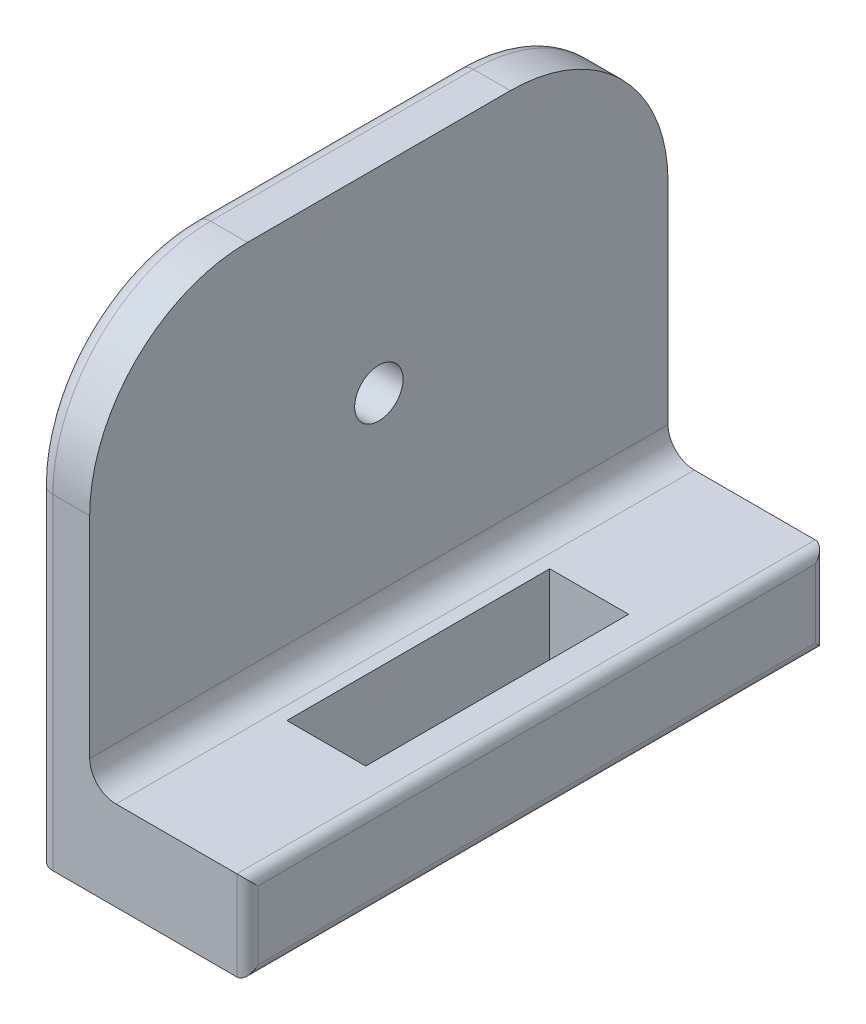
ISO-10303-21;
HEADER;
FILE_DESCRIPTION(('STEP AP214'),'2;1');
FILE_NAME('part.step','',(''),(''),'','','');
FILE_SCHEMA(('AUTOMOTIVE_DESIGN { 1 0 10303 214 1 1 1 1 }'));
ENDSEC;
DATA;
#1=APPLICATION_CONTEXT('core data for automotive mechanical design processes');
#2=APPLICATION_PROTOCOL_DEFINITION('international standard','automotive_design',2000,#1);
#3=PRODUCT_CONTEXT('',#1,'mechanical');
#4=PRODUCT('Part','Part','',(#3));
#5=PRODUCT_RELATED_PRODUCT_CATEGORY('part','',(#4));
#6=PRODUCT_DEFINITION_FORMATION('','',#4);
#7=PRODUCT_DEFINITION_CONTEXT('part definition',#1,'design');
#8=PRODUCT_DEFINITION('design','',#6,#7);
#9=PRODUCT_DEFINITION_SHAPE('','',#8);
#10=(LENGTH_UNIT() NAMED_UNIT(*) SI_UNIT(.MILLI.,.METRE.));
#11=(NAMED_UNIT(*) PLANE_ANGLE_UNIT() SI_UNIT($,.RADIAN.));
#12=(NAMED_UNIT(*) SI_UNIT($,.STERADIAN.) SOLID_ANGLE_UNIT());
#13=UNCERTAINTY_MEASURE_WITH_UNIT(LENGTH_MEASURE(1.E-05),#10,'distance_accuracy_value','');
#14=(GEOMETRIC_REPRESENTATION_CONTEXT(3) GLOBAL_UNCERTAINTY_ASSIGNED_CONTEXT((#13)) GLOBAL_UNIT_ASSIGNED_CONTEXT((#10,
#11,#12)) REPRESENTATION_CONTEXT('',''));
#15=CARTESIAN_POINT('',(0.,0.,0.));
#16=DIRECTION('',(0.,0.,1.));
#17=DIRECTION('',(1.,0.,0.));
#18=AXIS2_PLACEMENT_3D('',#15,#16,#17);
#19=CARTESIAN_POINT('',(0.,17.,0.));
#20=DIRECTION('',(0.,-1.,0.));
#21=DIRECTION('',(0.,0.,-1.));
#22=AXIS2_PLACEMENT_3D('',#19,#20,#21);
#23=PLANE('',#22);
#24=DIRECTION('',(0.,0.,-1.));
#25=VECTOR('',#24,1.);
#26=CARTESIAN_POINT('',(32.5,17.,-80.));
#27=LINE('',#26,#25);
#28=CARTESIAN_POINT('',(32.5,17.,-30.));
#29=VERTEX_POINT('',#28);
#30=CARTESIAN_POINT('',(32.5,17.,-80.));
#31=VERTEX_POINT('',#30);
#32=EDGE_CURVE('E201',#29,#31,#27,.T.);
#33=ORIENTED_EDGE('',*,*,#32,.F.);
#34=DIRECTION('',(1.,0.,0.));
#35=VECTOR('',#34,1.);
#36=CARTESIAN_POINT('',(17.5,17.,-30.));
#37=LINE('',#36,#35);
#38=CARTESIAN_POINT('',(17.5,17.,-30.));
#39=VERTEX_POINT('',#38);
#40=EDGE_CURVE('E190',#39,#29,#37,.T.);
#41=ORIENTED_EDGE('',*,*,#40,.F.);
#42=DIRECTION('',(0.,0.,1.));
#43=VECTOR('',#42,1.);
#44=CARTESIAN_POINT('',(17.5,17.,-80.));
#45=LINE('',#44,#43);
#46=CARTESIAN_POINT('',(17.5,17.,-80.));
#47=VERTEX_POINT('',#46);
#48=EDGE_CURVE('E205',#47,#39,#45,.T.);
#49=ORIENTED_EDGE('',*,*,#48,.F.);
#50=DIRECTION('',(-1.,0.,0.));
#51=VECTOR('',#50,1.);
#52=CARTESIAN_POINT('',(17.5,17.,-80.));
#53=LINE('',#52,#51);
#54=EDGE_CURVE('E198',#31,#47,#53,.T.);
#55=ORIENTED_EDGE('',*,*,#54,.F.);
#56=EDGE_LOOP('',(#33,#41,#49,#55));
#57=FACE_BOUND('',#56,.T.);
#58=DIRECTION('',(1.,0.,0.));
#59=VECTOR('',#58,1.);
#60=CARTESIAN_POINT('',(0.,17.,0.));
#61=LINE('',#60,#59);
#62=CARTESIAN_POINT('',(15.,17.,0.));
#63=VERTEX_POINT('',#62);
#64=CARTESIAN_POINT('',(38.,17.,0.));
#65=VERTEX_POINT('',#64);
#66=EDGE_CURVE('E233',#63,#65,#61,.T.);
#67=ORIENTED_EDGE('',*,*,#66,.T.);
#68=DIRECTION('',(0.,0.,-1.));
#69=VECTOR('',#68,1.);
#70=CARTESIAN_POINT('',(38.,17.,0.));
#71=LINE('',#70,#69);
#72=CARTESIAN_POINT('',(38.,17.,-110.));
#73=VERTEX_POINT('',#72);
#74=EDGE_CURVE('E70',#65,#73,#71,.T.);
#75=ORIENTED_EDGE('',*,*,#74,.T.);
#76=DIRECTION('',(-1.,0.,0.));
#77=VECTOR('',#76,1.);
#78=CARTESIAN_POINT('',(0.,17.,-110.));
#79=LINE('',#78,#77);
#80=CARTESIAN_POINT('',(15.,17.,-110.));
#81=VERTEX_POINT('',#80);
#82=EDGE_CURVE('E236',#73,#81,#79,.T.);
#83=ORIENTED_EDGE('',*,*,#82,.T.);
#84=DIRECTION('',(0.,0.,-1.));
#85=VECTOR('',#84,1.);
#86=CARTESIAN_POINT('',(15.,17.,0.));
#87=LINE('',#86,#85);
#88=EDGE_CURVE('E328',#81,#63,#87,.F.);
#89=ORIENTED_EDGE('',*,*,#88,.T.);
#90=EDGE_LOOP('',(#67,#75,#83,#89));
#91=FACE_BOUND('',#90,.T.);
#92=ADVANCED_FACE('F45',(#57,#91),#23,.F.);
#93=CARTESIAN_POINT('',(0.,17.,0.));
#94=DIRECTION('',(1.,0.,0.));
#95=DIRECTION('',(0.,0.,-1.));
#96=AXIS2_PLACEMENT_3D('',#93,#94,#95);
#97=PLANE('',#96);
#98=CARTESIAN_POINT('',(0.,54.7,-55.));
#99=DIRECTION('',(1.,0.,0.));
#100=DIRECTION('',(0.,0.,-1.));
#101=AXIS2_PLACEMENT_3D('',#98,#99,#100);
#102=CIRCLE('',#101,4.6);
#103=CARTESIAN_POINT('',(0.,54.7,-59.6));
#104=VERTEX_POINT('',#103);
#105=EDGE_CURVE('E667',#104,#104,#102,.F.);
#106=ORIENTED_EDGE('',*,*,#105,.F.);
#107=EDGE_LOOP('',(#106));
#108=FACE_BOUND('',#107,.T.);
#109=DIRECTION('',(0.,0.,1.));
#110=VECTOR('',#109,1.);
#111=CARTESIAN_POINT('',(0.,0.,0.));
#112=LINE('',#111,#110);
#113=CARTESIAN_POINT('',(0.,0.,-107.));
#114=VERTEX_POINT('',#113);
#115=CARTESIAN_POINT('',(0.,0.,-3.));
#116=VERTEX_POINT('',#115);
#117=EDGE_CURVE('E232',#114,#116,#112,.T.);
#118=ORIENTED_EDGE('',*,*,#117,.T.);
#119=DIRECTION('',(0.,-1.,0.));
#120=VECTOR('',#119,1.);
#121=CARTESIAN_POINT('',(0.,17.,-3.));
#122=LINE('',#121,#120);
#123=CARTESIAN_POINT('',(0.,62.,-3.));
#124=VERTEX_POINT('',#123);
#125=EDGE_CURVE('E283',#116,#124,#122,.F.);
#126=ORIENTED_EDGE('',*,*,#125,.T.);
#127=CARTESIAN_POINT('',(0.,62.,-30.));
#128=DIRECTION('',(1.,0.,0.));
#129=DIRECTION('',(0.,0.,-1.));
#130=AXIS2_PLACEMENT_3D('',#127,#128,#129);
#131=CIRCLE('',#130,27.);
#132=CARTESIAN_POINT('',(0.,89.,-30.));
#133=VERTEX_POINT('',#132);
#134=EDGE_CURVE('E279',#124,#133,#131,.F.);
#135=ORIENTED_EDGE('',*,*,#134,.T.);
#136=DIRECTION('',(0.,0.,1.));
#137=VECTOR('',#136,1.);
#138=CARTESIAN_POINT('',(0.,89.,0.));
#139=LINE('',#138,#137);
#140=CARTESIAN_POINT('',(0.,89.,-80.));
#141=VERTEX_POINT('',#140);
#142=EDGE_CURVE('E276',#133,#141,#139,.F.);
#143=ORIENTED_EDGE('',*,*,#142,.T.);
#144=CARTESIAN_POINT('',(0.,62.,-80.));
#145=DIRECTION('',(1.,0.,0.));
#146=DIRECTION('',(0.,0.,-1.));
#147=AXIS2_PLACEMENT_3D('',#144,#145,#146);
#148=CIRCLE('',#147,27.);
#149=CARTESIAN_POINT('',(0.,62.,-107.));
#150=VERTEX_POINT('',#149);
#151=EDGE_CURVE('E273',#141,#150,#148,.F.);
#152=ORIENTED_EDGE('',*,*,#151,.T.);
#153=DIRECTION('',(0.,-1.,0.));
#154=VECTOR('',#153,1.);
#155=CARTESIAN_POINT('',(0.,17.,-107.));
#156=LINE('',#155,#154);
#157=EDGE_CURVE('E270',#150,#114,#156,.T.);
#158=ORIENTED_EDGE('',*,*,#157,.T.);
#159=EDGE_LOOP('',(#118,#126,#135,#143,#152,#158));
#160=FACE_BOUND('',#159,.T.);
#161=ADVANCED_FACE('F402',(#108,#160),#97,.F.);
#162=CARTESIAN_POINT('',(0.,17.,0.));
#163=DIRECTION('',(0.,0.,-1.));
#164=DIRECTION('',(-1.,0.,0.));
#165=AXIS2_PLACEMENT_3D('',#162,#163,#164);
#166=PLANE('',#165);
#167=DIRECTION('',(1.,0.,0.));
#168=VECTOR('',#167,1.);
#169=CARTESIAN_POINT('',(0.,0.,0.));
#170=LINE('',#169,#168);
#171=CARTESIAN_POINT('',(3.,0.,0.));
#172=VERTEX_POINT('',#171);
#173=CARTESIAN_POINT('',(38.,0.,0.));
#174=VERTEX_POINT('',#173);
#175=EDGE_CURVE('E244',#172,#174,#170,.T.);
#176=ORIENTED_EDGE('',*,*,#175,.T.);
#177=DIRECTION('',(0.,-1.,0.));
#178=VECTOR('',#177,1.);
#179=CARTESIAN_POINT('',(38.,17.,0.));
#180=LINE('',#179,#178);
#181=EDGE_CURVE('E351',#174,#65,#180,.F.);
#182=ORIENTED_EDGE('',*,*,#181,.T.);
#183=ORIENTED_EDGE('',*,*,#66,.F.);
#184=CARTESIAN_POINT('',(15.,22.,0.));
#185=DIRECTION('',(0.,0.,-1.));
#186=DIRECTION('',(-1.,0.,0.));
#187=AXIS2_PLACEMENT_3D('',#184,#185,#186);
#188=CIRCLE('',#187,5.);
#189=CARTESIAN_POINT('',(10.,22.,0.));
#190=VERTEX_POINT('',#189);
#191=EDGE_CURVE('E335',#63,#190,#188,.T.);
#192=ORIENTED_EDGE('',*,*,#191,.T.);
#193=DIRECTION('',(0.,-1.,0.));
#194=VECTOR('',#193,1.);
#195=CARTESIAN_POINT('',(10.,17.,0.));
#196=LINE('',#195,#194);
#197=CARTESIAN_POINT('',(10.,62.,0.));
#198=VERTEX_POINT('',#197);
#199=EDGE_CURVE('E221',#198,#190,#196,.T.);
#200=ORIENTED_EDGE('',*,*,#199,.F.);
#201=DIRECTION('',(-1.,0.,0.));
#202=VECTOR('',#201,1.);
#203=CARTESIAN_POINT('',(0.,62.,0.));
#204=LINE('',#203,#202);
#205=CARTESIAN_POINT('',(3.,62.,0.));
#206=VERTEX_POINT('',#205);
#207=EDGE_CURVE('E240',#198,#206,#204,.T.);
#208=ORIENTED_EDGE('',*,*,#207,.T.);
#209=DIRECTION('',(0.,-1.,0.));
#210=VECTOR('',#209,1.);
#211=CARTESIAN_POINT('',(3.,17.,0.));
#212=LINE('',#211,#210);
#213=EDGE_CURVE('E295',#206,#172,#212,.T.);
#214=ORIENTED_EDGE('',*,*,#213,.T.);
#215=EDGE_LOOP('',(#176,#182,#183,#192,#200,#208,#214));
#216=FACE_BOUND('',#215,.T.);
#217=ADVANCED_FACE('F386',(#216),#166,.F.);
#218=CARTESIAN_POINT('',(40.,17.,0.));
#219=DIRECTION('',(-1.,0.,0.));
#220=DIRECTION('',(0.,0.,1.));
#221=AXIS2_PLACEMENT_3D('',#218,#219,#220);
#222=PLANE('',#221);
#223=DIRECTION('',(0.,0.,-1.));
#224=VECTOR('',#223,1.);
#225=CARTESIAN_POINT('',(40.,15.,0.));
#226=LINE('',#225,#224);
#227=CARTESIAN_POINT('',(40.,15.,-108.));
#228=VERTEX_POINT('',#227);
#229=CARTESIAN_POINT('',(40.,15.,-2.));
#230=VERTEX_POINT('',#229);
#231=EDGE_CURVE('E344',#228,#230,#226,.F.);
#232=ORIENTED_EDGE('',*,*,#231,.T.);
#233=DIRECTION('',(0.,-1.,0.));
#234=VECTOR('',#233,1.);
#235=CARTESIAN_POINT('',(40.,17.,-2.));
#236=LINE('',#235,#234);
#237=CARTESIAN_POINT('',(40.,2.,-2.));
#238=VERTEX_POINT('',#237);
#239=EDGE_CURVE('E347',#230,#238,#236,.T.);
#240=ORIENTED_EDGE('',*,*,#239,.T.);
#241=DIRECTION('',(0.,0.,-1.));
#242=VECTOR('',#241,1.);
#243=CARTESIAN_POINT('',(40.,2.,-110.));
#244=LINE('',#243,#242);
#245=CARTESIAN_POINT('',(40.,2.,-108.));
#246=VERTEX_POINT('',#245);
#247=EDGE_CURVE('E338',#238,#246,#244,.T.);
#248=ORIENTED_EDGE('',*,*,#247,.T.);
#249=DIRECTION('',(0.,-1.,0.));
#250=VECTOR('',#249,1.);
#251=CARTESIAN_POINT('',(40.,17.,-108.));
#252=LINE('',#251,#250);
#253=EDGE_CURVE('E341',#246,#228,#252,.F.);
#254=ORIENTED_EDGE('',*,*,#253,.T.);
#255=EDGE_LOOP('',(#232,#240,#248,#254));
#256=FACE_BOUND('',#255,.T.);
#257=ADVANCED_FACE('F393',(#256),#222,.F.);
#258=CARTESIAN_POINT('',(0.,17.,-110.));
#259=DIRECTION('',(0.,0.,1.));
#260=DIRECTION('',(1.,0.,0.));
#261=AXIS2_PLACEMENT_3D('',#258,#259,#260);
#262=PLANE('',#261);
#263=ORIENTED_EDGE('',*,*,#82,.F.);
#264=DIRECTION('',(0.,-1.,0.));
#265=VECTOR('',#264,1.);
#266=CARTESIAN_POINT('',(38.,17.,-110.));
#267=LINE('',#266,#265);
#268=CARTESIAN_POINT('',(38.,0.,-110.));
#269=VERTEX_POINT('',#268);
#270=EDGE_CURVE('E55',#73,#269,#267,.T.);
#271=ORIENTED_EDGE('',*,*,#270,.T.);
#272=DIRECTION('',(-1.,0.,0.));
#273=VECTOR('',#272,1.);
#274=CARTESIAN_POINT('',(0.,0.,-110.));
#275=LINE('',#274,#273);
#276=CARTESIAN_POINT('',(3.,0.,-110.));
#277=VERTEX_POINT('',#276);
#278=EDGE_CURVE('E237',#269,#277,#275,.T.);
#279=ORIENTED_EDGE('',*,*,#278,.T.);
#280=DIRECTION('',(0.,-1.,0.));
#281=VECTOR('',#280,1.);
#282=CARTESIAN_POINT('',(3.,17.,-110.));
#283=LINE('',#282,#281);
#284=CARTESIAN_POINT('',(3.,62.,-110.));
#285=VERTEX_POINT('',#284);
#286=EDGE_CURVE('E305',#277,#285,#283,.F.);
#287=ORIENTED_EDGE('',*,*,#286,.T.);
#288=DIRECTION('',(-1.,0.,0.));
#289=VECTOR('',#288,1.);
#290=CARTESIAN_POINT('',(0.,62.,-110.));
#291=LINE('',#290,#289);
#292=CARTESIAN_POINT('',(10.,62.,-110.));
#293=VERTEX_POINT('',#292);
#294=EDGE_CURVE('E266',#285,#293,#291,.F.);
#295=ORIENTED_EDGE('',*,*,#294,.T.);
#296=DIRECTION('',(0.,1.,0.));
#297=VECTOR('',#296,1.);
#298=CARTESIAN_POINT('',(10.,17.,-110.));
#299=LINE('',#298,#297);
#300=CARTESIAN_POINT('',(10.,22.,-110.));
#301=VERTEX_POINT('',#300);
#302=EDGE_CURVE('E225',#301,#293,#299,.T.);
#303=ORIENTED_EDGE('',*,*,#302,.F.);
#304=CARTESIAN_POINT('',(15.,22.,-110.));
#305=DIRECTION('',(0.,0.,1.));
#306=DIRECTION('',(1.,0.,0.));
#307=AXIS2_PLACEMENT_3D('',#304,#305,#306);
#308=CIRCLE('',#307,5.);
#309=EDGE_CURVE('E331',#301,#81,#308,.T.);
#310=ORIENTED_EDGE('',*,*,#309,.T.);
#311=EDGE_LOOP('',(#263,#271,#279,#287,#295,#303,#310));
#312=FACE_BOUND('',#311,.T.);
#313=ADVANCED_FACE('F395',(#312),#262,.F.);
#314=CARTESIAN_POINT('',(0.,0.,0.));
#315=DIRECTION('',(0.,-1.,0.));
#316=DIRECTION('',(0.,0.,-1.));
#317=AXIS2_PLACEMENT_3D('',#314,#315,#316);
#318=PLANE('',#317);
#319=DIRECTION('',(1.,0.,0.));
#320=VECTOR('',#319,1.);
#321=CARTESIAN_POINT('',(17.5,0.,-30.));
#322=LINE('',#321,#320);
#323=CARTESIAN_POINT('',(17.5,0.,-30.));
#324=VERTEX_POINT('',#323);
#325=CARTESIAN_POINT('',(32.5,0.,-30.));
#326=VERTEX_POINT('',#325);
#327=EDGE_CURVE('E187',#324,#326,#322,.T.);
#328=ORIENTED_EDGE('',*,*,#327,.T.);
#329=DIRECTION('',(0.,0.,-1.));
#330=VECTOR('',#329,1.);
#331=CARTESIAN_POINT('',(32.5,0.,-80.));
#332=LINE('',#331,#330);
#333=CARTESIAN_POINT('',(32.5,0.,-80.));
#334=VERTEX_POINT('',#333);
#335=EDGE_CURVE('E172',#326,#334,#332,.T.);
#336=ORIENTED_EDGE('',*,*,#335,.T.);
#337=DIRECTION('',(-1.,0.,0.));
#338=VECTOR('',#337,1.);
#339=CARTESIAN_POINT('',(17.5,0.,-80.));
#340=LINE('',#339,#338);
#341=CARTESIAN_POINT('',(17.5,0.,-80.));
#342=VERTEX_POINT('',#341);
#343=EDGE_CURVE('E211',#334,#342,#340,.T.);
#344=ORIENTED_EDGE('',*,*,#343,.T.);
#345=DIRECTION('',(0.,0.,1.));
#346=VECTOR('',#345,1.);
#347=CARTESIAN_POINT('',(17.5,0.,-80.));
#348=LINE('',#347,#346);
#349=EDGE_CURVE('E196',#342,#324,#348,.T.);
#350=ORIENTED_EDGE('',*,*,#349,.T.);
#351=EDGE_LOOP('',(#328,#336,#344,#350));
#352=FACE_BOUND('',#351,.T.);
#353=ORIENTED_EDGE('',*,*,#278,.F.);
#354=DIRECTION('',(0.,0.,-1.));
#355=VECTOR('',#354,1.);
#356=CARTESIAN_POINT('',(38.,0.,0.));
#357=LINE('',#356,#355);
#358=EDGE_CURVE('E11',#269,#174,#357,.F.);
#359=ORIENTED_EDGE('',*,*,#358,.T.);
#360=ORIENTED_EDGE('',*,*,#175,.F.);
#361=CARTESIAN_POINT('',(3.,0.,-3.));
#362=DIRECTION('',(0.,-1.,0.));
#363=DIRECTION('',(0.,0.,-1.));
#364=AXIS2_PLACEMENT_3D('',#361,#362,#363);
#365=CIRCLE('',#364,3.);
#366=EDGE_CURVE('E302',#172,#116,#365,.T.);
#367=ORIENTED_EDGE('',*,*,#366,.T.);
#368=ORIENTED_EDGE('',*,*,#117,.F.);
#369=CARTESIAN_POINT('',(3.,0.,-107.));
#370=DIRECTION('',(0.,-1.,0.));
#371=DIRECTION('',(0.,0.,-1.));
#372=AXIS2_PLACEMENT_3D('',#369,#370,#371);
#373=CIRCLE('',#372,3.);
#374=EDGE_CURVE('E298',#114,#277,#373,.T.);
#375=ORIENTED_EDGE('',*,*,#374,.T.);
#376=EDGE_LOOP('',(#353,#359,#360,#367,#368,#375));
#377=FACE_BOUND('',#376,.T.);
#378=ADVANCED_FACE('F194',(#352,#377),#318,.T.);
#379=CARTESIAN_POINT('',(10.,92.,0.));
#380=DIRECTION('',(0.,-1.,0.));
#381=DIRECTION('',(0.,0.,-1.));
#382=AXIS2_PLACEMENT_3D('',#379,#380,#381);
#383=PLANE('',#382);
#384=DIRECTION('',(-1.,0.,0.));
#385=VECTOR('',#384,1.);
#386=CARTESIAN_POINT('',(10.,92.,-80.));
#387=LINE('',#386,#385);
#388=CARTESIAN_POINT('',(10.,92.,-80.));
#389=VERTEX_POINT('',#388);
#390=CARTESIAN_POINT('',(3.,92.,-80.));
#391=VERTEX_POINT('',#390);
#392=EDGE_CURVE('E253',#389,#391,#387,.T.);
#393=ORIENTED_EDGE('',*,*,#392,.T.);
#394=DIRECTION('',(0.,0.,1.));
#395=VECTOR('',#394,1.);
#396=CARTESIAN_POINT('',(3.,92.,0.));
#397=LINE('',#396,#395);
#398=CARTESIAN_POINT('',(3.,92.,-30.));
#399=VERTEX_POINT('',#398);
#400=EDGE_CURVE('E289',#391,#399,#397,.T.);
#401=ORIENTED_EDGE('',*,*,#400,.T.);
#402=DIRECTION('',(-1.,0.,0.));
#403=VECTOR('',#402,1.);
#404=CARTESIAN_POINT('',(10.,92.,-30.));
#405=LINE('',#404,#403);
#406=CARTESIAN_POINT('',(10.,92.,-30.));
#407=VERTEX_POINT('',#406);
#408=EDGE_CURVE('E257',#399,#407,#405,.F.);
#409=ORIENTED_EDGE('',*,*,#408,.T.);
#410=DIRECTION('',(0.,0.,1.));
#411=VECTOR('',#410,1.);
#412=CARTESIAN_POINT('',(10.,92.,0.));
#413=LINE('',#412,#411);
#414=EDGE_CURVE('E228',#389,#407,#413,.T.);
#415=ORIENTED_EDGE('',*,*,#414,.F.);
#416=EDGE_LOOP('',(#393,#401,#409,#415));
#417=FACE_BOUND('',#416,.T.);
#418=ADVANCED_FACE('F415',(#417),#383,.F.);
#419=CARTESIAN_POINT('',(10.,0.,0.));
#420=DIRECTION('',(-1.,0.,0.));
#421=DIRECTION('',(0.,0.,1.));
#422=AXIS2_PLACEMENT_3D('',#419,#420,#421);
#423=PLANE('',#422);
#424=CARTESIAN_POINT('',(10.,54.7,-55.));
#425=DIRECTION('',(1.,0.,0.));
#426=DIRECTION('',(0.,0.,-1.));
#427=AXIS2_PLACEMENT_3D('',#424,#425,#426);
#428=CIRCLE('',#427,4.6);
#429=CARTESIAN_POINT('',(10.,54.7,-59.6));
#430=VERTEX_POINT('',#429);
#431=EDGE_CURVE('E324',#430,#430,#428,.T.);
#432=ORIENTED_EDGE('',*,*,#431,.F.);
#433=EDGE_LOOP('',(#432));
#434=FACE_BOUND('',#433,.T.);
#435=ORIENTED_EDGE('',*,*,#199,.T.);
#436=DIRECTION('',(0.,0.,-1.));
#437=VECTOR('',#436,1.);
#438=CARTESIAN_POINT('',(10.,22.,-110.));
#439=LINE('',#438,#437);
#440=EDGE_CURVE('E308',#190,#301,#439,.T.);
#441=ORIENTED_EDGE('',*,*,#440,.T.);
#442=ORIENTED_EDGE('',*,*,#302,.T.);
#443=CARTESIAN_POINT('',(10.,62.,-80.));
#444=DIRECTION('',(-1.,0.,0.));
#445=DIRECTION('',(0.,0.,1.));
#446=AXIS2_PLACEMENT_3D('',#443,#444,#445);
#447=CIRCLE('',#446,30.);
#448=EDGE_CURVE('E260',#293,#389,#447,.F.);
#449=ORIENTED_EDGE('',*,*,#448,.T.);
#450=ORIENTED_EDGE('',*,*,#414,.T.);
#451=CARTESIAN_POINT('',(10.,62.,-30.));
#452=DIRECTION('',(-1.,0.,0.));
#453=DIRECTION('',(0.,0.,1.));
#454=AXIS2_PLACEMENT_3D('',#451,#452,#453);
#455=CIRCLE('',#454,30.);
#456=EDGE_CURVE('E263',#407,#198,#455,.F.);
#457=ORIENTED_EDGE('',*,*,#456,.T.);
#458=EDGE_LOOP('',(#435,#441,#442,#449,#450,#457));
#459=FACE_BOUND('',#458,.T.);
#460=ADVANCED_FACE('F422',(#434,#459),#423,.F.);
#461=CARTESIAN_POINT('',(17.5,-52.2015325445528,-30.));
#462=DIRECTION('',(0.,0.,1.));
#463=DIRECTION('',(1.,0.,0.));
#464=AXIS2_PLACEMENT_3D('',#461,#462,#463);
#465=PLANE('',#464);
#466=DIRECTION('',(0.,1.,0.));
#467=VECTOR('',#466,1.);
#468=CARTESIAN_POINT('',(17.5,-52.2015325445528,-30.));
#469=LINE('',#468,#467);
#470=EDGE_CURVE('E209',#324,#39,#469,.T.);
#471=ORIENTED_EDGE('',*,*,#470,.T.);
#472=ORIENTED_EDGE('',*,*,#40,.T.);
#473=DIRECTION('',(0.,1.,0.));
#474=VECTOR('',#473,1.);
#475=CARTESIAN_POINT('',(32.5,-52.2015325445528,-30.));
#476=LINE('',#475,#474);
#477=EDGE_CURVE('E176',#326,#29,#476,.T.);
#478=ORIENTED_EDGE('',*,*,#477,.F.);
#479=ORIENTED_EDGE('',*,*,#327,.F.);
#480=EDGE_LOOP('',(#471,#472,#478,#479));
#481=FACE_BOUND('',#480,.T.);
#482=ADVANCED_FACE('F186',(#481),#465,.F.);
#483=CARTESIAN_POINT('',(32.5,-52.2015325445528,-80.));
#484=DIRECTION('',(1.,0.,0.));
#485=DIRECTION('',(0.,0.,-1.));
#486=AXIS2_PLACEMENT_3D('',#483,#484,#485);
#487=PLANE('',#486);
#488=ORIENTED_EDGE('',*,*,#477,.T.);
#489=ORIENTED_EDGE('',*,*,#32,.T.);
#490=DIRECTION('',(0.,1.,0.));
#491=VECTOR('',#490,1.);
#492=CARTESIAN_POINT('',(32.5,-52.2015325445528,-80.));
#493=LINE('',#492,#491);
#494=EDGE_CURVE('E178',#334,#31,#493,.T.);
#495=ORIENTED_EDGE('',*,*,#494,.F.);
#496=ORIENTED_EDGE('',*,*,#335,.F.);
#497=EDGE_LOOP('',(#488,#489,#495,#496));
#498=FACE_BOUND('',#497,.T.);
#499=ADVANCED_FACE('F174',(#498),#487,.F.);
#500=CARTESIAN_POINT('',(17.5,-52.2015325445528,-80.));
#501=DIRECTION('',(0.,0.,-1.));
#502=DIRECTION('',(-1.,0.,0.));
#503=AXIS2_PLACEMENT_3D('',#500,#501,#502);
#504=PLANE('',#503);
#505=ORIENTED_EDGE('',*,*,#494,.T.);
#506=ORIENTED_EDGE('',*,*,#54,.T.);
#507=DIRECTION('',(0.,1.,0.));
#508=VECTOR('',#507,1.);
#509=CARTESIAN_POINT('',(17.5,-52.2015325445528,-80.));
#510=LINE('',#509,#508);
#511=EDGE_CURVE('E210',#342,#47,#510,.T.);
#512=ORIENTED_EDGE('',*,*,#511,.F.);
#513=ORIENTED_EDGE('',*,*,#343,.F.);
#514=EDGE_LOOP('',(#505,#506,#512,#513));
#515=FACE_BOUND('',#514,.T.);
#516=ADVANCED_FACE('F573',(#515),#504,.F.);
#517=CARTESIAN_POINT('',(17.5,-52.2015325445528,-80.));
#518=DIRECTION('',(-1.,0.,0.));
#519=DIRECTION('',(0.,0.,1.));
#520=AXIS2_PLACEMENT_3D('',#517,#518,#519);
#521=PLANE('',#520);
#522=ORIENTED_EDGE('',*,*,#511,.T.);
#523=ORIENTED_EDGE('',*,*,#48,.T.);
#524=ORIENTED_EDGE('',*,*,#470,.F.);
#525=ORIENTED_EDGE('',*,*,#349,.F.);
#526=EDGE_LOOP('',(#522,#523,#524,#525));
#527=FACE_BOUND('',#526,.T.);
#528=ADVANCED_FACE('F564',(#527),#521,.F.);
#529=CARTESIAN_POINT('',(-13.0107647738325,54.7,-55.));
#530=DIRECTION('',(1.,0.,0.));
#531=DIRECTION('',(0.,0.,-1.));
#532=AXIS2_PLACEMENT_3D('',#529,#530,#531);
#533=CYLINDRICAL_SURFACE('',#532,4.6);
#534=CARTESIAN_POINT('',(0.,54.7,-59.6));
#535=CARTESIAN_POINT('',(0.104166666666667,54.7,-59.6));
#536=CARTESIAN_POINT('',(0.208333333333334,54.7,-59.6));
#537=CARTESIAN_POINT('',(0.416666666666667,54.7,-59.6));
#538=CARTESIAN_POINT('',(0.520833333333334,54.7,-59.6));
#539=CARTESIAN_POINT('',(0.729166666666667,54.7,-59.6));
#540=CARTESIAN_POINT('',(0.833333333333333,54.7,-59.6));
#541=CARTESIAN_POINT('',(1.04166666666667,54.7,-59.6));
#542=CARTESIAN_POINT('',(1.14583333333333,54.7,-59.6));
#543=CARTESIAN_POINT('',(1.35416666666667,54.7,-59.6));
#544=CARTESIAN_POINT('',(1.45833333333333,54.7,-59.6));
#545=CARTESIAN_POINT('',(1.66666666666667,54.7,-59.6));
#546=CARTESIAN_POINT('',(1.77083333333333,54.7,-59.6));
#547=CARTESIAN_POINT('',(1.97916666666667,54.7,-59.6));
#548=CARTESIAN_POINT('',(2.08333333333333,54.7,-59.6));
#549=CARTESIAN_POINT('',(2.29166666666667,54.7,-59.6));
#550=CARTESIAN_POINT('',(2.39583333333333,54.7,-59.6));
#551=CARTESIAN_POINT('',(2.60416666666666,54.7,-59.6));
#552=CARTESIAN_POINT('',(2.70833333333333,54.7,-59.6));
#553=CARTESIAN_POINT('',(2.91666666666666,54.7,-59.6));
#554=CARTESIAN_POINT('',(3.02083333333333,54.7,-59.6));
#555=CARTESIAN_POINT('',(3.22916666666666,54.7,-59.6));
#556=CARTESIAN_POINT('',(3.33333333333333,54.7,-59.6));
#557=CARTESIAN_POINT('',(3.54166666666666,54.7,-59.6));
#558=CARTESIAN_POINT('',(3.64583333333333,54.7,-59.6));
#559=CARTESIAN_POINT('',(3.85416666666667,54.7,-59.6));
#560=CARTESIAN_POINT('',(3.95833333333333,54.7,-59.6));
#561=CARTESIAN_POINT('',(4.16666666666667,54.7,-59.6));
#562=CARTESIAN_POINT('',(4.27083333333333,54.7,-59.6));
#563=CARTESIAN_POINT('',(4.47916666666667,54.7,-59.6));
#564=CARTESIAN_POINT('',(4.58333333333333,54.7,-59.6));
#565=CARTESIAN_POINT('',(4.79166666666667,54.7,-59.6));
#566=CARTESIAN_POINT('',(4.89583333333333,54.7,-59.6));
#567=CARTESIAN_POINT('',(5.10416666666667,54.7,-59.6));
#568=CARTESIAN_POINT('',(5.20833333333333,54.7,-59.6));
#569=CARTESIAN_POINT('',(5.41666666666667,54.7,-59.6));
#570=CARTESIAN_POINT('',(5.52083333333333,54.7,-59.6));
#571=CARTESIAN_POINT('',(5.72916666666666,54.7,-59.6));
#572=CARTESIAN_POINT('',(5.83333333333333,54.7,-59.6));
#573=CARTESIAN_POINT('',(6.04166666666666,54.7,-59.6));
#574=CARTESIAN_POINT('',(6.14583333333333,54.7,-59.6));
#575=CARTESIAN_POINT('',(6.35416666666666,54.7,-59.6));
#576=CARTESIAN_POINT('',(6.45833333333333,54.7,-59.6));
#577=CARTESIAN_POINT('',(6.66666666666666,54.7,-59.6));
#578=CARTESIAN_POINT('',(6.77083333333333,54.7,-59.6));
#579=CARTESIAN_POINT('',(6.97916666666666,54.7,-59.6));
#580=CARTESIAN_POINT('',(7.08333333333333,54.7,-59.6));
#581=CARTESIAN_POINT('',(7.29166666666666,54.7,-59.6));
#582=CARTESIAN_POINT('',(7.39583333333333,54.7,-59.6));
#583=CARTESIAN_POINT('',(7.60416666666666,54.7,-59.6));
#584=CARTESIAN_POINT('',(7.70833333333333,54.7,-59.6));
#585=CARTESIAN_POINT('',(7.91666666666666,54.7,-59.6));
#586=CARTESIAN_POINT('',(8.02083333333333,54.7,-59.6));
#587=CARTESIAN_POINT('',(8.22916666666666,54.7,-59.6));
#588=CARTESIAN_POINT('',(8.33333333333333,54.7,-59.6));
#589=CARTESIAN_POINT('',(8.54166666666666,54.7,-59.6));
#590=CARTESIAN_POINT('',(8.64583333333333,54.7,-59.6));
#591=CARTESIAN_POINT('',(8.85416666666666,54.7,-59.6));
#592=CARTESIAN_POINT('',(8.95833333333333,54.7,-59.6));
#593=CARTESIAN_POINT('',(9.16666666666666,54.7,-59.6));
#594=CARTESIAN_POINT('',(9.27083333333333,54.7,-59.6));
#595=CARTESIAN_POINT('',(9.47916666666666,54.7,-59.6));
#596=CARTESIAN_POINT('',(9.58333333333333,54.7,-59.6));
#597=CARTESIAN_POINT('',(9.79166666666666,54.7,-59.6));
#598=CARTESIAN_POINT('',(9.89583333333333,54.7,-59.6));
#599=CARTESIAN_POINT('',(10.,54.7,-59.6));
#600=B_SPLINE_CURVE_WITH_KNOTS('',3,(#534,#535,#536,#537,#538,#539,#540,#541,#542,#543,#544,
#545,#546,#547,#548,#549,#550,#551,#552,#553,#554,#555,#556,#557,#558,#559,#560,#561,#562,#563,
#564,#565,#566,#567,#568,#569,#570,#571,#572,#573,#574,#575,#576,#577,#578,#579,#580,#581,#582,
#583,#584,#585,#586,#587,#588,#589,#590,#591,#592,#593,#594,#595,#596,#597,#598,#599),
.UNSPECIFIED.,.F.,.F.,(4,2,2,2,2,2,2,2,2,2,2,2,2,2,2,2,2,2,2,2,2,2,2,2,2,2,2,2,2,2,2,2,4),(0.,
0.3125,0.625000000000001,0.937499999999999,1.25,1.5625,1.875,2.1875,2.5,2.8125,3.125,3.4375,
3.75,4.0625,4.375,4.6875,5.,5.3125,5.625,5.9375,6.25,6.5625,6.875,7.1875,7.5,7.8125,
8.12499999999999,8.43749999999999,8.75,9.0625,9.375,9.6875,10.),.UNSPECIFIED.);
#601=EDGE_CURVE('BSEAM556',#104,#430,#600,.T.);
#602=ORIENTED_EDGE('',*,*,#105,.T.);
#603=ORIENTED_EDGE('',*,*,#431,.T.);
#604=ORIENTED_EDGE('',*,*,#601,.T.);
#605=ORIENTED_EDGE('',*,*,#601,.F.);
#606=EDGE_LOOP('',(#602,#604,#603,#605));
#607=FACE_BOUND('',#606,.T.);
#608=ADVANCED_FACE('F556',(#607),#533,.F.);
#609=CARTESIAN_POINT('',(0.,62.,-30.));
#610=DIRECTION('',(-1.,0.,0.));
#611=DIRECTION('',(0.,0.,1.));
#612=AXIS2_PLACEMENT_3D('',#609,#610,#611);
#613=CYLINDRICAL_SURFACE('',#612,30.);
#614=ORIENTED_EDGE('',*,*,#408,.F.);
#615=CARTESIAN_POINT('',(3.,62.,-30.));
#616=DIRECTION('',(1.,0.,0.));
#617=DIRECTION('',(0.,0.,-1.));
#618=AXIS2_PLACEMENT_3D('',#615,#616,#617);
#619=CIRCLE('',#618,30.);
#620=EDGE_CURVE('E286',#399,#206,#619,.T.);
#621=ORIENTED_EDGE('',*,*,#620,.T.);
#622=ORIENTED_EDGE('',*,*,#207,.F.);
#623=ORIENTED_EDGE('',*,*,#456,.F.);
#624=EDGE_LOOP('',(#614,#621,#622,#623));
#625=FACE_BOUND('',#624,.T.);
#626=ADVANCED_FACE('F451',(#625),#613,.T.);
#627=CARTESIAN_POINT('',(10.,62.,-80.));
#628=DIRECTION('',(-1.,0.,0.));
#629=DIRECTION('',(0.,0.,1.));
#630=AXIS2_PLACEMENT_3D('',#627,#628,#629);
#631=CYLINDRICAL_SURFACE('',#630,30.);
#632=ORIENTED_EDGE('',*,*,#294,.F.);
#633=CARTESIAN_POINT('',(3.,62.,-80.));
#634=DIRECTION('',(1.,0.,0.));
#635=DIRECTION('',(0.,0.,-1.));
#636=AXIS2_PLACEMENT_3D('',#633,#634,#635);
#637=CIRCLE('',#636,30.);
#638=EDGE_CURVE('E292',#285,#391,#637,.T.);
#639=ORIENTED_EDGE('',*,*,#638,.T.);
#640=ORIENTED_EDGE('',*,*,#392,.F.);
#641=ORIENTED_EDGE('',*,*,#448,.F.);
#642=EDGE_LOOP('',(#632,#639,#640,#641));
#643=FACE_BOUND('',#642,.T.);
#644=ADVANCED_FACE('F467',(#643),#631,.T.);
#645=CARTESIAN_POINT('',(3.,17.,-107.));
#646=DIRECTION('',(0.,-1.,0.));
#647=DIRECTION('',(0.,0.,-1.));
#648=AXIS2_PLACEMENT_3D('',#645,#646,#647);
#649=CYLINDRICAL_SURFACE('',#648,3.);
#650=ORIENTED_EDGE('',*,*,#374,.F.);
#651=ORIENTED_EDGE('',*,*,#157,.F.);
#652=CARTESIAN_POINT('',(3.,62.,-107.));
#653=DIRECTION('',(0.,1.,0.));
#654=DIRECTION('',(0.,0.,1.));
#655=AXIS2_PLACEMENT_3D('',#652,#653,#654);
#656=CIRCLE('',#655,3.);
#657=EDGE_CURVE('E320',#285,#150,#656,.T.);
#658=ORIENTED_EDGE('',*,*,#657,.F.);
#659=ORIENTED_EDGE('',*,*,#286,.F.);
#660=EDGE_LOOP('',(#650,#651,#658,#659));
#661=FACE_BOUND('',#660,.T.);
#662=ADVANCED_FACE('F463',(#661),#649,.T.);
#663=CARTESIAN_POINT('',(3.,62.,-80.));
#664=DIRECTION('',(1.,0.,0.));
#665=DIRECTION('',(0.,0.,-1.));
#666=AXIS2_PLACEMENT_3D('',#663,#664,#665);
#667=TOROIDAL_SURFACE('',#666,27.,3.);
#668=ORIENTED_EDGE('',*,*,#657,.T.);
#669=ORIENTED_EDGE('',*,*,#151,.F.);
#670=CARTESIAN_POINT('',(3.,89.,-80.));
#671=DIRECTION('',(0.,0.,1.));
#672=DIRECTION('',(1.,0.,0.));
#673=AXIS2_PLACEMENT_3D('',#670,#671,#672);
#674=CIRCLE('',#673,3.);
#675=EDGE_CURVE('E316',#391,#141,#674,.T.);
#676=ORIENTED_EDGE('',*,*,#675,.F.);
#677=ORIENTED_EDGE('',*,*,#638,.F.);
#678=EDGE_LOOP('',(#668,#669,#676,#677));
#679=FACE_BOUND('',#678,.T.);
#680=ADVANCED_FACE('F439',(#679),#667,.T.);
#681=CARTESIAN_POINT('',(3.,17.,-3.));
#682=DIRECTION('',(0.,-1.,0.));
#683=DIRECTION('',(0.,0.,-1.));
#684=AXIS2_PLACEMENT_3D('',#681,#682,#683);
#685=CYLINDRICAL_SURFACE('',#684,3.);
#686=ORIENTED_EDGE('',*,*,#366,.F.);
#687=ORIENTED_EDGE('',*,*,#213,.F.);
#688=CARTESIAN_POINT('',(3.,62.,-3.));
#689=DIRECTION('',(0.,1.,0.));
#690=DIRECTION('',(0.,0.,1.));
#691=AXIS2_PLACEMENT_3D('',#688,#689,#690);
#692=CIRCLE('',#691,3.);
#693=EDGE_CURVE('E312',#124,#206,#692,.T.);
#694=ORIENTED_EDGE('',*,*,#693,.F.);
#695=ORIENTED_EDGE('',*,*,#125,.F.);
#696=EDGE_LOOP('',(#686,#687,#694,#695));
#697=FACE_BOUND('',#696,.T.);
#698=ADVANCED_FACE('F455',(#697),#685,.T.);
#699=CARTESIAN_POINT('',(3.,89.,0.));
#700=DIRECTION('',(0.,0.,1.));
#701=DIRECTION('',(1.,0.,0.));
#702=AXIS2_PLACEMENT_3D('',#699,#700,#701);
#703=CYLINDRICAL_SURFACE('',#702,3.);
#704=ORIENTED_EDGE('',*,*,#675,.T.);
#705=ORIENTED_EDGE('',*,*,#142,.F.);
#706=CARTESIAN_POINT('',(3.,89.,-30.));
#707=DIRECTION('',(0.,0.,1.));
#708=DIRECTION('',(1.,0.,0.));
#709=AXIS2_PLACEMENT_3D('',#706,#707,#708);
#710=CIRCLE('',#709,3.);
#711=EDGE_CURVE('E309',#399,#133,#710,.T.);
#712=ORIENTED_EDGE('',*,*,#711,.F.);
#713=ORIENTED_EDGE('',*,*,#400,.F.);
#714=EDGE_LOOP('',(#704,#705,#712,#713));
#715=FACE_BOUND('',#714,.T.);
#716=ADVANCED_FACE('F443',(#715),#703,.T.);
#717=CARTESIAN_POINT('',(3.,62.,-30.));
#718=DIRECTION('',(1.,0.,0.));
#719=DIRECTION('',(0.,0.,-1.));
#720=AXIS2_PLACEMENT_3D('',#717,#718,#719);
#721=TOROIDAL_SURFACE('',#720,27.,3.);
#722=ORIENTED_EDGE('',*,*,#693,.T.);
#723=ORIENTED_EDGE('',*,*,#620,.F.);
#724=ORIENTED_EDGE('',*,*,#711,.T.);
#725=ORIENTED_EDGE('',*,*,#134,.F.);
#726=EDGE_LOOP('',(#722,#723,#724,#725));
#727=FACE_BOUND('',#726,.T.);
#728=ADVANCED_FACE('F447',(#727),#721,.T.);
#729=CARTESIAN_POINT('',(15.,22.,0.));
#730=DIRECTION('',(0.,0.,1.));
#731=DIRECTION('',(1.,0.,0.));
#732=AXIS2_PLACEMENT_3D('',#729,#730,#731);
#733=CYLINDRICAL_SURFACE('',#732,5.);
#734=ORIENTED_EDGE('',*,*,#191,.F.);
#735=ORIENTED_EDGE('',*,*,#88,.F.);
#736=ORIENTED_EDGE('',*,*,#309,.F.);
#737=ORIENTED_EDGE('',*,*,#440,.F.);
#738=EDGE_LOOP('',(#734,#735,#736,#737));
#739=FACE_BOUND('',#738,.T.);
#740=ADVANCED_FACE('F473',(#739),#733,.F.);
#741=CARTESIAN_POINT('',(38.,17.,-108.));
#742=DIRECTION('',(0.,-1.,0.));
#743=DIRECTION('',(0.,0.,-1.));
#744=AXIS2_PLACEMENT_3D('',#741,#742,#743);
#745=CYLINDRICAL_SURFACE('',#744,2.);
#746=CARTESIAN_POINT('',(38.,2.,-108.));
#747=DIRECTION('',(0.,-0.707106781186547,0.707106781186547));
#748=DIRECTION('',(0.,0.707106781186547,0.707106781186547));
#749=AXIS2_PLACEMENT_3D('',#746,#747,#748);
#750=ELLIPSE('',#749,2.82842712474619,2.);
#751=EDGE_CURVE('E364',#269,#246,#750,.T.);
#752=ORIENTED_EDGE('',*,*,#751,.F.);
#753=ORIENTED_EDGE('',*,*,#270,.F.);
#754=CARTESIAN_POINT('',(38.,15.,-108.));
#755=DIRECTION('',(0.,-0.707106781186547,-0.707106781186547));
#756=DIRECTION('',(0.,-0.707106781186547,0.707106781186547));
#757=AXIS2_PLACEMENT_3D('',#754,#755,#756);
#758=ELLIPSE('',#757,2.82842712474619,2.);
#759=EDGE_CURVE('E49',#228,#73,#758,.F.);
#760=ORIENTED_EDGE('',*,*,#759,.F.);
#761=ORIENTED_EDGE('',*,*,#253,.F.);
#762=EDGE_LOOP('',(#752,#753,#760,#761));
#763=FACE_BOUND('',#762,.T.);
#764=ADVANCED_FACE('F47',(#763),#745,.T.);
#765=CARTESIAN_POINT('',(38.,15.,0.));
#766=DIRECTION('',(0.,0.,-1.));
#767=DIRECTION('',(-1.,0.,0.));
#768=AXIS2_PLACEMENT_3D('',#765,#766,#767);
#769=CYLINDRICAL_SURFACE('',#768,2.);
#770=ORIENTED_EDGE('',*,*,#759,.T.);
#771=ORIENTED_EDGE('',*,*,#74,.F.);
#772=CARTESIAN_POINT('',(38.,15.,-2.));
#773=DIRECTION('',(0.,0.707106781186547,-0.707106781186547));
#774=DIRECTION('',(0.,-0.707106781186547,-0.707106781186547));
#775=AXIS2_PLACEMENT_3D('',#772,#773,#774);
#776=ELLIPSE('',#775,2.82842712474619,2.);
#777=EDGE_CURVE('E362',#230,#65,#776,.F.);
#778=ORIENTED_EDGE('',*,*,#777,.F.);
#779=ORIENTED_EDGE('',*,*,#231,.F.);
#780=EDGE_LOOP('',(#770,#771,#778,#779));
#781=FACE_BOUND('',#780,.T.);
#782=ADVANCED_FACE('F376',(#781),#769,.T.);
#783=CARTESIAN_POINT('',(38.,2.,0.));
#784=DIRECTION('',(0.,0.,1.));
#785=DIRECTION('',(1.,0.,0.));
#786=AXIS2_PLACEMENT_3D('',#783,#784,#785);
#787=CYLINDRICAL_SURFACE('',#786,2.);
#788=ORIENTED_EDGE('',*,*,#751,.T.);
#789=ORIENTED_EDGE('',*,*,#247,.F.);
#790=CARTESIAN_POINT('',(38.,2.,-2.));
#791=DIRECTION('',(0.,0.707106781186547,0.707106781186547));
#792=DIRECTION('',(0.,-0.707106781186547,0.707106781186547));
#793=AXIS2_PLACEMENT_3D('',#790,#791,#792);
#794=ELLIPSE('',#793,2.82842712474619,2.);
#795=EDGE_CURVE('E359',#174,#238,#794,.T.);
#796=ORIENTED_EDGE('',*,*,#795,.F.);
#797=ORIENTED_EDGE('',*,*,#358,.F.);
#798=EDGE_LOOP('',(#788,#789,#796,#797));
#799=FACE_BOUND('',#798,.T.);
#800=ADVANCED_FACE('F381',(#799),#787,.T.);
#801=CARTESIAN_POINT('',(38.,17.,-2.));
#802=DIRECTION('',(0.,-1.,0.));
#803=DIRECTION('',(0.,0.,-1.));
#804=AXIS2_PLACEMENT_3D('',#801,#802,#803);
#805=CYLINDRICAL_SURFACE('',#804,2.);
#806=ORIENTED_EDGE('',*,*,#777,.T.);
#807=ORIENTED_EDGE('',*,*,#181,.F.);
#808=ORIENTED_EDGE('',*,*,#795,.T.);
#809=ORIENTED_EDGE('',*,*,#239,.F.);
#810=EDGE_LOOP('',(#806,#807,#808,#809));
#811=FACE_BOUND('',#810,.T.);
#812=ADVANCED_FACE('F390',(#811),#805,.T.);
#813=CLOSED_SHELL('',(#92,#161,#217,#257,#313,#378,#418,#460,#482,#499,#516,#528,#608,#626,#644,
#662,#680,#698,#716,#728,#740,#764,#782,#800,#812));
#814=MANIFOLD_SOLID_BREP('B2',#813);
#815=ADVANCED_BREP_SHAPE_REPRESENTATION('',(#18,#814),#14);
#816=SHAPE_DEFINITION_REPRESENTATION(#9,#815);
ENDSEC;
END-ISO-10303-21;
